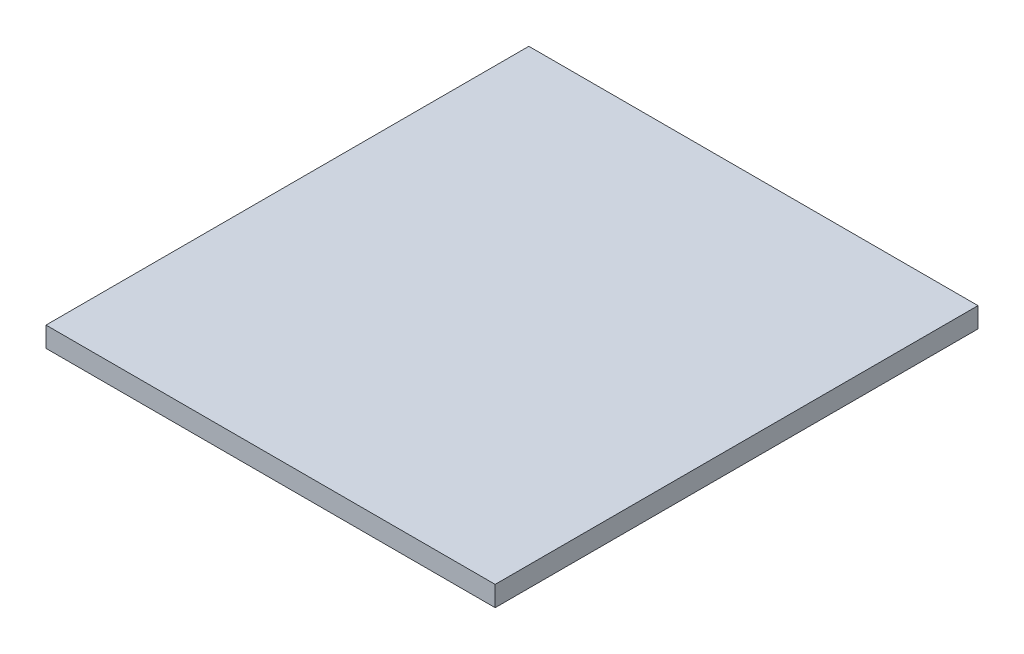
ISO-10303-21;
HEADER;
FILE_DESCRIPTION(('STEP AP214'),'2;1');
FILE_NAME('part.step','',(''),(''),'','','');
FILE_SCHEMA(('AUTOMOTIVE_DESIGN { 1 0 10303 214 1 1 1 1 }'));
ENDSEC;
DATA;
#1=APPLICATION_CONTEXT('core data for automotive mechanical design processes');
#2=APPLICATION_PROTOCOL_DEFINITION('international standard','automotive_design',2000,#1);
#3=PRODUCT_CONTEXT('',#1,'mechanical');
#4=PRODUCT('Part','Part','',(#3));
#5=PRODUCT_RELATED_PRODUCT_CATEGORY('part','',(#4));
#6=PRODUCT_DEFINITION_FORMATION('','',#4);
#7=PRODUCT_DEFINITION_CONTEXT('part definition',#1,'design');
#8=PRODUCT_DEFINITION('design','',#6,#7);
#9=PRODUCT_DEFINITION_SHAPE('','',#8);
#10=(LENGTH_UNIT() NAMED_UNIT(*) SI_UNIT(.MILLI.,.METRE.));
#11=(NAMED_UNIT(*) PLANE_ANGLE_UNIT() SI_UNIT($,.RADIAN.));
#12=(NAMED_UNIT(*) SI_UNIT($,.STERADIAN.) SOLID_ANGLE_UNIT());
#13=UNCERTAINTY_MEASURE_WITH_UNIT(LENGTH_MEASURE(1.E-05),#10,'distance_accuracy_value','');
#14=(GEOMETRIC_REPRESENTATION_CONTEXT(3) GLOBAL_UNCERTAINTY_ASSIGNED_CONTEXT((#13)) GLOBAL_UNIT_ASSIGNED_CONTEXT((#10,
#11,#12)) REPRESENTATION_CONTEXT('',''));
#15=CARTESIAN_POINT('',(0.,0.,0.));
#16=DIRECTION('',(0.,0.,1.));
#17=DIRECTION('',(1.,0.,0.));
#18=AXIS2_PLACEMENT_3D('',#15,#16,#17);
#19=CARTESIAN_POINT('',(-200.,18.,215.));
#20=DIRECTION('',(1.,0.,0.));
#21=DIRECTION('',(0.,0.,-1.));
#22=AXIS2_PLACEMENT_3D('',#19,#20,#21);
#23=PLANE('',#22);
#24=DIRECTION('',(0.,0.,1.));
#25=VECTOR('',#24,1.);
#26=CARTESIAN_POINT('',(-200.,0.,215.));
#27=LINE('',#26,#25);
#28=CARTESIAN_POINT('',(-200.,0.,-215.));
#29=VERTEX_POINT('',#28);
#30=CARTESIAN_POINT('',(-200.,0.,215.));
#31=VERTEX_POINT('',#30);
#32=EDGE_CURVE('E107',#29,#31,#27,.T.);
#33=ORIENTED_EDGE('',*,*,#32,.T.);
#34=DIRECTION('',(0.,-1.,0.));
#35=VECTOR('',#34,1.);
#36=CARTESIAN_POINT('',(-200.,18.,215.));
#37=LINE('',#36,#35);
#38=CARTESIAN_POINT('',(-200.,18.,215.));
#39=VERTEX_POINT('',#38);
#40=EDGE_CURVE('E11',#39,#31,#37,.T.);
#41=ORIENTED_EDGE('',*,*,#40,.F.);
#42=DIRECTION('',(0.,0.,1.));
#43=VECTOR('',#42,1.);
#44=CARTESIAN_POINT('',(-200.,18.,215.));
#45=LINE('',#44,#43);
#46=CARTESIAN_POINT('',(-200.,18.,-215.));
#47=VERTEX_POINT('',#46);
#48=EDGE_CURVE('E91',#47,#39,#45,.T.);
#49=ORIENTED_EDGE('',*,*,#48,.F.);
#50=DIRECTION('',(0.,-1.,0.));
#51=VECTOR('',#50,1.);
#52=CARTESIAN_POINT('',(-200.,18.,-215.));
#53=LINE('',#52,#51);
#54=EDGE_CURVE('E103',#47,#29,#53,.T.);
#55=ORIENTED_EDGE('',*,*,#54,.T.);
#56=EDGE_LOOP('',(#33,#41,#49,#55));
#57=FACE_BOUND('',#56,.T.);
#58=ADVANCED_FACE('F39',(#57),#23,.F.);
#59=CARTESIAN_POINT('',(-200.,18.,215.));
#60=DIRECTION('',(0.,0.,-1.));
#61=DIRECTION('',(-1.,0.,0.));
#62=AXIS2_PLACEMENT_3D('',#59,#60,#61);
#63=PLANE('',#62);
#64=DIRECTION('',(1.,0.,0.));
#65=VECTOR('',#64,1.);
#66=CARTESIAN_POINT('',(-200.,0.,215.));
#67=LINE('',#66,#65);
#68=CARTESIAN_POINT('',(200.,0.,215.));
#69=VERTEX_POINT('',#68);
#70=EDGE_CURVE('E96',#31,#69,#67,.T.);
#71=ORIENTED_EDGE('',*,*,#70,.T.);
#72=DIRECTION('',(0.,-1.,0.));
#73=VECTOR('',#72,1.);
#74=CARTESIAN_POINT('',(200.,18.,215.));
#75=LINE('',#74,#73);
#76=CARTESIAN_POINT('',(200.,18.,215.));
#77=VERTEX_POINT('',#76);
#78=EDGE_CURVE('E48',#77,#69,#75,.T.);
#79=ORIENTED_EDGE('',*,*,#78,.F.);
#80=DIRECTION('',(1.,0.,0.));
#81=VECTOR('',#80,1.);
#82=CARTESIAN_POINT('',(-200.,18.,215.));
#83=LINE('',#82,#81);
#84=EDGE_CURVE('E86',#39,#77,#83,.T.);
#85=ORIENTED_EDGE('',*,*,#84,.F.);
#86=ORIENTED_EDGE('',*,*,#40,.T.);
#87=EDGE_LOOP('',(#71,#79,#85,#86));
#88=FACE_BOUND('',#87,.T.);
#89=ADVANCED_FACE('F95',(#88),#63,.F.);
#90=CARTESIAN_POINT('',(200.,18.,215.));
#91=DIRECTION('',(-1.,0.,0.));
#92=DIRECTION('',(0.,0.,1.));
#93=AXIS2_PLACEMENT_3D('',#90,#91,#92);
#94=PLANE('',#93);
#95=DIRECTION('',(0.,0.,-1.));
#96=VECTOR('',#95,1.);
#97=CARTESIAN_POINT('',(200.,0.,215.));
#98=LINE('',#97,#96);
#99=CARTESIAN_POINT('',(200.,0.,-215.));
#100=VERTEX_POINT('',#99);
#101=EDGE_CURVE('E73',#69,#100,#98,.T.);
#102=ORIENTED_EDGE('',*,*,#101,.T.);
#103=DIRECTION('',(0.,-1.,0.));
#104=VECTOR('',#103,1.);
#105=CARTESIAN_POINT('',(200.,18.,-215.));
#106=LINE('',#105,#104);
#107=CARTESIAN_POINT('',(200.,18.,-215.));
#108=VERTEX_POINT('',#107);
#109=EDGE_CURVE('E98',#108,#100,#106,.T.);
#110=ORIENTED_EDGE('',*,*,#109,.F.);
#111=DIRECTION('',(0.,0.,-1.));
#112=VECTOR('',#111,1.);
#113=CARTESIAN_POINT('',(200.,18.,215.));
#114=LINE('',#113,#112);
#115=EDGE_CURVE('E89',#77,#108,#114,.T.);
#116=ORIENTED_EDGE('',*,*,#115,.F.);
#117=ORIENTED_EDGE('',*,*,#78,.T.);
#118=EDGE_LOOP('',(#102,#110,#116,#117));
#119=FACE_BOUND('',#118,.T.);
#120=ADVANCED_FACE('F99',(#119),#94,.F.);
#121=CARTESIAN_POINT('',(-200.,18.,-215.));
#122=DIRECTION('',(0.,0.,1.));
#123=DIRECTION('',(1.,0.,0.));
#124=AXIS2_PLACEMENT_3D('',#121,#122,#123);
#125=PLANE('',#124);
#126=DIRECTION('',(-1.,0.,0.));
#127=VECTOR('',#126,1.);
#128=CARTESIAN_POINT('',(-200.,0.,-215.));
#129=LINE('',#128,#127);
#130=EDGE_CURVE('E79',#100,#29,#129,.T.);
#131=ORIENTED_EDGE('',*,*,#130,.T.);
#132=ORIENTED_EDGE('',*,*,#54,.F.);
#133=DIRECTION('',(-1.,0.,0.));
#134=VECTOR('',#133,1.);
#135=CARTESIAN_POINT('',(-200.,18.,-215.));
#136=LINE('',#135,#134);
#137=EDGE_CURVE('E56',#108,#47,#136,.T.);
#138=ORIENTED_EDGE('',*,*,#137,.F.);
#139=ORIENTED_EDGE('',*,*,#109,.T.);
#140=EDGE_LOOP('',(#131,#132,#138,#139));
#141=FACE_BOUND('',#140,.T.);
#142=ADVANCED_FACE('F120',(#141),#125,.F.);
#143=CARTESIAN_POINT('',(0.,18.,0.));
#144=DIRECTION('',(0.,-1.,0.));
#145=DIRECTION('',(0.,0.,-1.));
#146=AXIS2_PLACEMENT_3D('',#143,#144,#145);
#147=PLANE('',#146);
#148=ORIENTED_EDGE('',*,*,#48,.T.);
#149=ORIENTED_EDGE('',*,*,#84,.T.);
#150=ORIENTED_EDGE('',*,*,#115,.T.);
#151=ORIENTED_EDGE('',*,*,#137,.T.);
#152=EDGE_LOOP('',(#148,#149,#150,#151));
#153=FACE_BOUND('',#152,.T.);
#154=ADVANCED_FACE('F87',(#153),#147,.F.);
#155=CARTESIAN_POINT('',(0.,0.,0.));
#156=DIRECTION('',(0.,-1.,0.));
#157=DIRECTION('',(0.,0.,-1.));
#158=AXIS2_PLACEMENT_3D('',#155,#156,#157);
#159=PLANE('',#158);
#160=ORIENTED_EDGE('',*,*,#32,.F.);
#161=ORIENTED_EDGE('',*,*,#130,.F.);
#162=ORIENTED_EDGE('',*,*,#101,.F.);
#163=ORIENTED_EDGE('',*,*,#70,.F.);
#164=EDGE_LOOP('',(#160,#161,#162,#163));
#165=FACE_BOUND('',#164,.T.);
#166=ADVANCED_FACE('F123',(#165),#159,.T.);
#167=CLOSED_SHELL('',(#58,#89,#120,#142,#154,#166));
#168=MANIFOLD_SOLID_BREP('B2',#167);
#169=ADVANCED_BREP_SHAPE_REPRESENTATION('',(#18,#168),#14);
#170=SHAPE_DEFINITION_REPRESENTATION(#9,#169);
ENDSEC;
END-ISO-10303-21;
